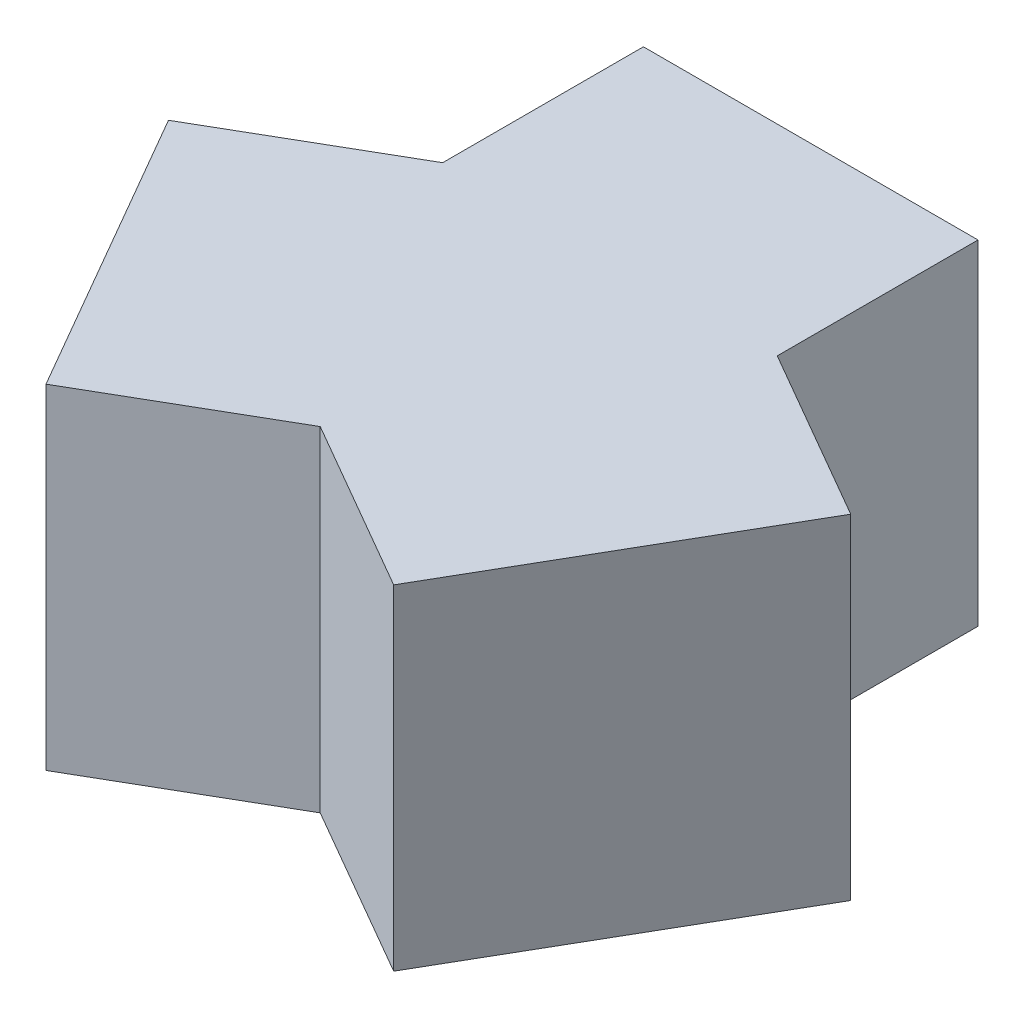
ISO-10303-21;
HEADER;
FILE_DESCRIPTION(('STEP AP214'),'2;1');
FILE_NAME('part.step','',(''),(''),'','','');
FILE_SCHEMA(('AUTOMOTIVE_DESIGN { 1 0 10303 214 1 1 1 1 }'));
ENDSEC;
DATA;
#1=APPLICATION_CONTEXT('core data for automotive mechanical design processes');
#2=APPLICATION_PROTOCOL_DEFINITION('international standard','automotive_design',2000,#1);
#3=PRODUCT_CONTEXT('',#1,'mechanical');
#4=PRODUCT('Part','Part','',(#3));
#5=PRODUCT_RELATED_PRODUCT_CATEGORY('part','',(#4));
#6=PRODUCT_DEFINITION_FORMATION('','',#4);
#7=PRODUCT_DEFINITION_CONTEXT('part definition',#1,'design');
#8=PRODUCT_DEFINITION('design','',#6,#7);
#9=PRODUCT_DEFINITION_SHAPE('','',#8);
#10=(LENGTH_UNIT() NAMED_UNIT(*) SI_UNIT(.MILLI.,.METRE.));
#11=(NAMED_UNIT(*) PLANE_ANGLE_UNIT() SI_UNIT($,.RADIAN.));
#12=(NAMED_UNIT(*) SI_UNIT($,.STERADIAN.) SOLID_ANGLE_UNIT());
#13=UNCERTAINTY_MEASURE_WITH_UNIT(LENGTH_MEASURE(1.E-05),#10,'distance_accuracy_value','');
#14=(GEOMETRIC_REPRESENTATION_CONTEXT(3) GLOBAL_UNCERTAINTY_ASSIGNED_CONTEXT((#13)) GLOBAL_UNIT_ASSIGNED_CONTEXT((#10,
#11,#12)) REPRESENTATION_CONTEXT('',''));
#15=CARTESIAN_POINT('',(0.,0.,0.));
#16=DIRECTION('',(0.,0.,1.));
#17=DIRECTION('',(1.,0.,0.));
#18=AXIS2_PLACEMENT_3D('',#15,#16,#17);
#19=CARTESIAN_POINT('',(7.50000000000006,7.5,-5.));
#20=DIRECTION('',(-1.,0.,0.));
#21=DIRECTION('',(0.,0.,1.));
#22=AXIS2_PLACEMENT_3D('',#19,#20,#21);
#23=PLANE('',#22);
#24=DIRECTION('',(0.,0.,-1.));
#25=VECTOR('',#24,1.);
#26=CARTESIAN_POINT('',(7.50000000000006,-7.5,-5.));
#27=LINE('',#26,#25);
#28=CARTESIAN_POINT('',(7.50000000000006,-7.5,-5.));
#29=VERTEX_POINT('',#28);
#30=CARTESIAN_POINT('',(7.50000000000006,-7.5,-14.));
#31=VERTEX_POINT('',#30);
#32=EDGE_CURVE('E138',#29,#31,#27,.T.);
#33=ORIENTED_EDGE('',*,*,#32,.T.);
#34=DIRECTION('',(0.,-1.,0.));
#35=VECTOR('',#34,1.);
#36=CARTESIAN_POINT('',(7.50000000000006,7.5,-14.));
#37=LINE('',#36,#35);
#38=CARTESIAN_POINT('',(7.50000000000006,7.5,-14.));
#39=VERTEX_POINT('',#38);
#40=EDGE_CURVE('E11',#39,#31,#37,.T.);
#41=ORIENTED_EDGE('',*,*,#40,.F.);
#42=DIRECTION('',(0.,0.,-1.));
#43=VECTOR('',#42,1.);
#44=CARTESIAN_POINT('',(7.50000000000006,7.5,-5.));
#45=LINE('',#44,#43);
#46=CARTESIAN_POINT('',(7.50000000000006,7.5,-5.));
#47=VERTEX_POINT('',#46);
#48=EDGE_CURVE('E154',#47,#39,#45,.T.);
#49=ORIENTED_EDGE('',*,*,#48,.F.);
#50=DIRECTION('',(0.,-1.,0.));
#51=VECTOR('',#50,1.);
#52=CARTESIAN_POINT('',(7.50000000000006,7.5,-5.));
#53=LINE('',#52,#51);
#54=EDGE_CURVE('E134',#47,#29,#53,.T.);
#55=ORIENTED_EDGE('',*,*,#54,.T.);
#56=EDGE_LOOP('',(#33,#41,#49,#55));
#57=FACE_BOUND('',#56,.T.);
#58=ADVANCED_FACE('F36',(#57),#23,.F.);
#59=CARTESIAN_POINT('',(-7.50000000000006,7.5,-14.));
#60=DIRECTION('',(0.,0.,1.));
#61=DIRECTION('',(1.,0.,0.));
#62=AXIS2_PLACEMENT_3D('',#59,#60,#61);
#63=PLANE('',#62);
#64=DIRECTION('',(-1.,0.,0.));
#65=VECTOR('',#64,1.);
#66=CARTESIAN_POINT('',(-7.50000000000006,-7.5,-14.));
#67=LINE('',#66,#65);
#68=CARTESIAN_POINT('',(-7.50000000000006,-7.5,-14.));
#69=VERTEX_POINT('',#68);
#70=EDGE_CURVE('E141',#31,#69,#67,.T.);
#71=ORIENTED_EDGE('',*,*,#70,.T.);
#72=DIRECTION('',(0.,-1.,0.));
#73=VECTOR('',#72,1.);
#74=CARTESIAN_POINT('',(-7.50000000000006,7.5,-14.));
#75=LINE('',#74,#73);
#76=CARTESIAN_POINT('',(-7.50000000000006,7.5,-14.));
#77=VERTEX_POINT('',#76);
#78=EDGE_CURVE('E44',#77,#69,#75,.T.);
#79=ORIENTED_EDGE('',*,*,#78,.F.);
#80=DIRECTION('',(-1.,0.,0.));
#81=VECTOR('',#80,1.);
#82=CARTESIAN_POINT('',(-7.50000000000006,7.5,-14.));
#83=LINE('',#82,#81);
#84=EDGE_CURVE('E98',#39,#77,#83,.T.);
#85=ORIENTED_EDGE('',*,*,#84,.F.);
#86=ORIENTED_EDGE('',*,*,#40,.T.);
#87=EDGE_LOOP('',(#71,#79,#85,#86));
#88=FACE_BOUND('',#87,.T.);
#89=ADVANCED_FACE('F197',(#88),#63,.F.);
#90=CARTESIAN_POINT('',(-7.50000000000006,7.5,-5.));
#91=DIRECTION('',(1.,0.,0.));
#92=DIRECTION('',(0.,0.,-1.));
#93=AXIS2_PLACEMENT_3D('',#90,#91,#92);
#94=PLANE('',#93);
#95=DIRECTION('',(0.,0.,1.));
#96=VECTOR('',#95,1.);
#97=CARTESIAN_POINT('',(-7.50000000000006,-7.5,-5.));
#98=LINE('',#97,#96);
#99=CARTESIAN_POINT('',(-7.50000000000006,-7.5,-5.));
#100=VERTEX_POINT('',#99);
#101=EDGE_CURVE('E143',#69,#100,#98,.T.);
#102=ORIENTED_EDGE('',*,*,#101,.T.);
#103=DIRECTION('',(0.,-1.,0.));
#104=VECTOR('',#103,1.);
#105=CARTESIAN_POINT('',(-7.50000000000006,7.5,-5.));
#106=LINE('',#105,#104);
#107=CARTESIAN_POINT('',(-7.50000000000006,7.5,-5.));
#108=VERTEX_POINT('',#107);
#109=EDGE_CURVE('E164',#108,#100,#106,.T.);
#110=ORIENTED_EDGE('',*,*,#109,.F.);
#111=DIRECTION('',(0.,0.,1.));
#112=VECTOR('',#111,1.);
#113=CARTESIAN_POINT('',(-7.50000000000006,7.5,-5.));
#114=LINE('',#113,#112);
#115=EDGE_CURVE('E172',#77,#108,#114,.T.);
#116=ORIENTED_EDGE('',*,*,#115,.F.);
#117=ORIENTED_EDGE('',*,*,#78,.T.);
#118=EDGE_LOOP('',(#102,#110,#116,#117));
#119=FACE_BOUND('',#118,.T.);
#120=ADVANCED_FACE('F170',(#119),#94,.F.);
#121=CARTESIAN_POINT('',(-15.29422863406,7.5,-0.499999999999995));
#122=DIRECTION('',(0.5,0.,0.866025403784438));
#123=DIRECTION('',(0.866025403784438,0.,-0.5));
#124=AXIS2_PLACEMENT_3D('',#121,#122,#123);
#125=PLANE('',#124);
#126=DIRECTION('',(-0.866025403784438,0.,0.5));
#127=VECTOR('',#126,1.);
#128=CARTESIAN_POINT('',(-15.29422863406,-7.5,-0.499999999999995));
#129=LINE('',#128,#127);
#130=CARTESIAN_POINT('',(-15.29422863406,-7.5,-0.499999999999995));
#131=VERTEX_POINT('',#130);
#132=EDGE_CURVE('E145',#100,#131,#129,.T.);
#133=ORIENTED_EDGE('',*,*,#132,.T.);
#134=DIRECTION('',(0.,-1.,0.));
#135=VECTOR('',#134,1.);
#136=CARTESIAN_POINT('',(-15.29422863406,7.5,-0.499999999999995));
#137=LINE('',#136,#135);
#138=CARTESIAN_POINT('',(-15.29422863406,7.5,-0.499999999999995));
#139=VERTEX_POINT('',#138);
#140=EDGE_CURVE('E161',#139,#131,#137,.T.);
#141=ORIENTED_EDGE('',*,*,#140,.F.);
#142=DIRECTION('',(-0.866025403784438,0.,0.5));
#143=VECTOR('',#142,1.);
#144=CARTESIAN_POINT('',(-15.29422863406,7.5,-0.499999999999995));
#145=LINE('',#144,#143);
#146=EDGE_CURVE('E188',#108,#139,#145,.T.);
#147=ORIENTED_EDGE('',*,*,#146,.F.);
#148=ORIENTED_EDGE('',*,*,#109,.T.);
#149=EDGE_LOOP('',(#133,#141,#147,#148));
#150=FACE_BOUND('',#149,.T.);
#151=ADVANCED_FACE('F181',(#150),#125,.F.);
#152=CARTESIAN_POINT('',(-15.29422863406,7.5,-0.499999999999995));
#153=DIRECTION('',(0.866025403784438,0.,-0.5));
#154=DIRECTION('',(-0.5,0.,-0.866025403784439));
#155=AXIS2_PLACEMENT_3D('',#152,#153,#154);
#156=PLANE('',#155);
#157=DIRECTION('',(0.5,0.,0.866025403784438));
#158=VECTOR('',#157,1.);
#159=CARTESIAN_POINT('',(-15.29422863406,-7.5,-0.499999999999995));
#160=LINE('',#159,#158);
#161=CARTESIAN_POINT('',(-7.79422863405994,-7.5,12.4903810567667));
#162=VERTEX_POINT('',#161);
#163=EDGE_CURVE('E147',#131,#162,#160,.T.);
#164=ORIENTED_EDGE('',*,*,#163,.T.);
#165=DIRECTION('',(0.,-1.,0.));
#166=VECTOR('',#165,1.);
#167=CARTESIAN_POINT('',(-7.79422863405994,7.5,12.4903810567667));
#168=LINE('',#167,#166);
#169=CARTESIAN_POINT('',(-7.79422863405994,7.5,12.4903810567667));
#170=VERTEX_POINT('',#169);
#171=EDGE_CURVE('E158',#170,#162,#168,.T.);
#172=ORIENTED_EDGE('',*,*,#171,.F.);
#173=DIRECTION('',(0.5,0.,0.866025403784438));
#174=VECTOR('',#173,1.);
#175=CARTESIAN_POINT('',(-15.29422863406,7.5,-0.499999999999995));
#176=LINE('',#175,#174);
#177=EDGE_CURVE('E187',#139,#170,#176,.T.);
#178=ORIENTED_EDGE('',*,*,#177,.F.);
#179=ORIENTED_EDGE('',*,*,#140,.T.);
#180=EDGE_LOOP('',(#164,#172,#178,#179));
#181=FACE_BOUND('',#180,.T.);
#182=ADVANCED_FACE('F185',(#181),#156,.F.);
#183=CARTESIAN_POINT('',(0.,7.5,7.99038105676669));
#184=DIRECTION('',(-0.5,0.,-0.866025403784438));
#185=DIRECTION('',(-0.866025403784439,0.,0.5));
#186=AXIS2_PLACEMENT_3D('',#183,#184,#185);
#187=PLANE('',#186);
#188=DIRECTION('',(0.866025403784439,0.,-0.5));
#189=VECTOR('',#188,1.);
#190=CARTESIAN_POINT('',(0.,-7.5,7.99038105676669));
#191=LINE('',#190,#189);
#192=CARTESIAN_POINT('',(0.,-7.5,7.99038105676669));
#193=VERTEX_POINT('',#192);
#194=EDGE_CURVE('E149',#162,#193,#191,.T.);
#195=ORIENTED_EDGE('',*,*,#194,.T.);
#196=DIRECTION('',(0.,-1.,0.));
#197=VECTOR('',#196,1.);
#198=CARTESIAN_POINT('',(0.,7.5,7.99038105676669));
#199=LINE('',#198,#197);
#200=CARTESIAN_POINT('',(0.,7.5,7.99038105676669));
#201=VERTEX_POINT('',#200);
#202=EDGE_CURVE('E129',#201,#193,#199,.T.);
#203=ORIENTED_EDGE('',*,*,#202,.F.);
#204=DIRECTION('',(0.866025403784439,0.,-0.5));
#205=VECTOR('',#204,1.);
#206=CARTESIAN_POINT('',(0.,7.5,7.99038105676669));
#207=LINE('',#206,#205);
#208=EDGE_CURVE('E120',#170,#201,#207,.T.);
#209=ORIENTED_EDGE('',*,*,#208,.F.);
#210=ORIENTED_EDGE('',*,*,#171,.T.);
#211=EDGE_LOOP('',(#195,#203,#209,#210));
#212=FACE_BOUND('',#211,.T.);
#213=ADVANCED_FACE('F209',(#212),#187,.F.);
#214=CARTESIAN_POINT('',(0.,7.5,7.99038105676669));
#215=DIRECTION('',(0.499999999999999,0.,-0.866025403784439));
#216=DIRECTION('',(-0.866025403784439,0.,-0.499999999999999));
#217=AXIS2_PLACEMENT_3D('',#214,#215,#216);
#218=PLANE('',#217);
#219=DIRECTION('',(0.866025403784439,0.,0.499999999999999));
#220=VECTOR('',#219,1.);
#221=CARTESIAN_POINT('',(0.,-7.5,7.99038105676669));
#222=LINE('',#221,#220);
#223=CARTESIAN_POINT('',(7.79422863405995,-7.5,12.4903810567667));
#224=VERTEX_POINT('',#223);
#225=EDGE_CURVE('E128',#193,#224,#222,.T.);
#226=ORIENTED_EDGE('',*,*,#225,.T.);
#227=DIRECTION('',(0.,-1.,0.));
#228=VECTOR('',#227,1.);
#229=CARTESIAN_POINT('',(7.79422863405995,7.5,12.4903810567667));
#230=LINE('',#229,#228);
#231=CARTESIAN_POINT('',(7.79422863405995,7.5,12.4903810567667));
#232=VERTEX_POINT('',#231);
#233=EDGE_CURVE('E125',#232,#224,#230,.T.);
#234=ORIENTED_EDGE('',*,*,#233,.F.);
#235=DIRECTION('',(0.866025403784439,0.,0.499999999999999));
#236=VECTOR('',#235,1.);
#237=CARTESIAN_POINT('',(0.,7.5,7.99038105676669));
#238=LINE('',#237,#236);
#239=EDGE_CURVE('E114',#201,#232,#238,.T.);
#240=ORIENTED_EDGE('',*,*,#239,.F.);
#241=ORIENTED_EDGE('',*,*,#202,.T.);
#242=EDGE_LOOP('',(#226,#234,#240,#241));
#243=FACE_BOUND('',#242,.T.);
#244=ADVANCED_FACE('F126',(#243),#218,.F.);
#245=CARTESIAN_POINT('',(15.29422863406,7.5,-0.499999999999999));
#246=DIRECTION('',(-0.866025403784439,0.,-0.5));
#247=DIRECTION('',(-0.5,0.,0.866025403784439));
#248=AXIS2_PLACEMENT_3D('',#245,#246,#247);
#249=PLANE('',#248);
#250=DIRECTION('',(0.5,0.,-0.866025403784439));
#251=VECTOR('',#250,1.);
#252=CARTESIAN_POINT('',(15.29422863406,-7.5,-0.499999999999999));
#253=LINE('',#252,#251);
#254=CARTESIAN_POINT('',(15.29422863406,-7.5,-0.499999999999999));
#255=VERTEX_POINT('',#254);
#256=EDGE_CURVE('E84',#224,#255,#253,.T.);
#257=ORIENTED_EDGE('',*,*,#256,.T.);
#258=DIRECTION('',(0.,-1.,0.));
#259=VECTOR('',#258,1.);
#260=CARTESIAN_POINT('',(15.29422863406,7.5,-0.499999999999999));
#261=LINE('',#260,#259);
#262=CARTESIAN_POINT('',(15.29422863406,7.5,-0.499999999999999));
#263=VERTEX_POINT('',#262);
#264=EDGE_CURVE('E130',#263,#255,#261,.T.);
#265=ORIENTED_EDGE('',*,*,#264,.F.);
#266=DIRECTION('',(0.5,0.,-0.866025403784439));
#267=VECTOR('',#266,1.);
#268=CARTESIAN_POINT('',(15.29422863406,7.5,-0.499999999999999));
#269=LINE('',#268,#267);
#270=EDGE_CURVE('E118',#232,#263,#269,.T.);
#271=ORIENTED_EDGE('',*,*,#270,.F.);
#272=ORIENTED_EDGE('',*,*,#233,.T.);
#273=EDGE_LOOP('',(#257,#265,#271,#272));
#274=FACE_BOUND('',#273,.T.);
#275=ADVANCED_FACE('F132',(#274),#249,.F.);
#276=CARTESIAN_POINT('',(15.29422863406,7.5,-0.499999999999999));
#277=DIRECTION('',(-0.5,0.,0.866025403784439));
#278=DIRECTION('',(0.866025403784439,0.,0.5));
#279=AXIS2_PLACEMENT_3D('',#276,#277,#278);
#280=PLANE('',#279);
#281=DIRECTION('',(-0.866025403784439,0.,-0.5));
#282=VECTOR('',#281,1.);
#283=CARTESIAN_POINT('',(15.29422863406,-7.5,-0.499999999999999));
#284=LINE('',#283,#282);
#285=EDGE_CURVE('E90',#255,#29,#284,.T.);
#286=ORIENTED_EDGE('',*,*,#285,.T.);
#287=ORIENTED_EDGE('',*,*,#54,.F.);
#288=DIRECTION('',(-0.866025403784439,0.,-0.5));
#289=VECTOR('',#288,1.);
#290=CARTESIAN_POINT('',(15.29422863406,7.5,-0.499999999999999));
#291=LINE('',#290,#289);
#292=EDGE_CURVE('E52',#263,#47,#291,.T.);
#293=ORIENTED_EDGE('',*,*,#292,.F.);
#294=ORIENTED_EDGE('',*,*,#264,.T.);
#295=EDGE_LOOP('',(#286,#287,#293,#294));
#296=FACE_BOUND('',#295,.T.);
#297=ADVANCED_FACE('F217',(#296),#280,.F.);
#298=CARTESIAN_POINT('',(0.,7.5,0.));
#299=DIRECTION('',(0.,-1.,0.));
#300=DIRECTION('',(0.,0.,-1.));
#301=AXIS2_PLACEMENT_3D('',#298,#299,#300);
#302=PLANE('',#301);
#303=ORIENTED_EDGE('',*,*,#48,.T.);
#304=ORIENTED_EDGE('',*,*,#84,.T.);
#305=ORIENTED_EDGE('',*,*,#115,.T.);
#306=ORIENTED_EDGE('',*,*,#146,.T.);
#307=ORIENTED_EDGE('',*,*,#177,.T.);
#308=ORIENTED_EDGE('',*,*,#208,.T.);
#309=ORIENTED_EDGE('',*,*,#239,.T.);
#310=ORIENTED_EDGE('',*,*,#270,.T.);
#311=ORIENTED_EDGE('',*,*,#292,.T.);
#312=EDGE_LOOP('',(#303,#304,#305,#306,#307,#308,#309,#310,#311));
#313=FACE_BOUND('',#312,.T.);
#314=ADVANCED_FACE('F116',(#313),#302,.F.);
#315=CARTESIAN_POINT('',(0.,-7.5,0.));
#316=DIRECTION('',(0.,-1.,0.));
#317=DIRECTION('',(0.,0.,-1.));
#318=AXIS2_PLACEMENT_3D('',#315,#316,#317);
#319=PLANE('',#318);
#320=ORIENTED_EDGE('',*,*,#32,.F.);
#321=ORIENTED_EDGE('',*,*,#285,.F.);
#322=ORIENTED_EDGE('',*,*,#256,.F.);
#323=ORIENTED_EDGE('',*,*,#225,.F.);
#324=ORIENTED_EDGE('',*,*,#194,.F.);
#325=ORIENTED_EDGE('',*,*,#163,.F.);
#326=ORIENTED_EDGE('',*,*,#132,.F.);
#327=ORIENTED_EDGE('',*,*,#101,.F.);
#328=ORIENTED_EDGE('',*,*,#70,.F.);
#329=EDGE_LOOP('',(#320,#321,#322,#323,#324,#325,#326,#327,#328));
#330=FACE_BOUND('',#329,.T.);
#331=ADVANCED_FACE('F176',(#330),#319,.T.);
#332=CLOSED_SHELL('',(#58,#89,#120,#151,#182,#213,#244,#275,#297,#314,#331));
#333=MANIFOLD_SOLID_BREP('B2',#332);
#334=ADVANCED_BREP_SHAPE_REPRESENTATION('',(#18,#333),#14);
#335=SHAPE_DEFINITION_REPRESENTATION(#9,#334);
ENDSEC;
END-ISO-10303-21;
